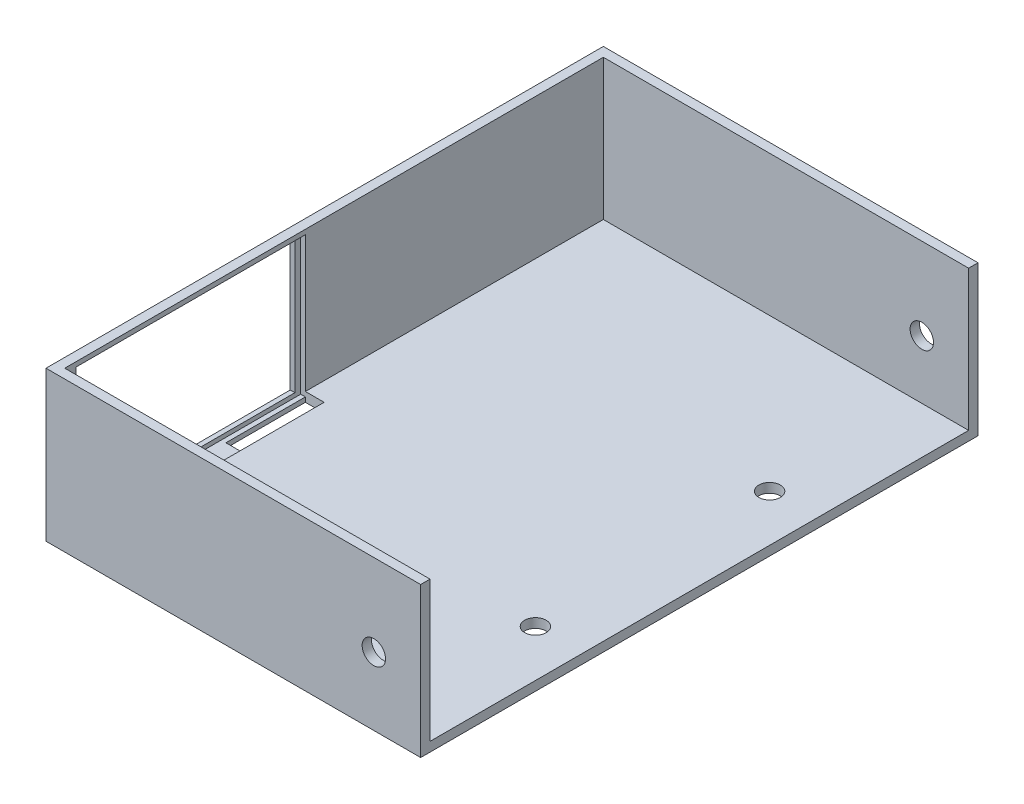
ISO-10303-21;
HEADER;
FILE_DESCRIPTION(('STEP AP214'),'2;1');
FILE_NAME('part.step','',(''),(''),'','','');
FILE_SCHEMA(('AUTOMOTIVE_DESIGN { 1 0 10303 214 1 1 1 1 }'));
ENDSEC;
DATA;
#1=APPLICATION_CONTEXT('core data for automotive mechanical design processes');
#2=APPLICATION_PROTOCOL_DEFINITION('international standard','automotive_design',2000,#1);
#3=PRODUCT_CONTEXT('',#1,'mechanical');
#4=PRODUCT('Part','Part','',(#3));
#5=PRODUCT_RELATED_PRODUCT_CATEGORY('part','',(#4));
#6=PRODUCT_DEFINITION_FORMATION('','',#4);
#7=PRODUCT_DEFINITION_CONTEXT('part definition',#1,'design');
#8=PRODUCT_DEFINITION('design','',#6,#7);
#9=PRODUCT_DEFINITION_SHAPE('','',#8);
#10=(LENGTH_UNIT() NAMED_UNIT(*) SI_UNIT(.MILLI.,.METRE.));
#11=(NAMED_UNIT(*) PLANE_ANGLE_UNIT() SI_UNIT($,.RADIAN.));
#12=(NAMED_UNIT(*) SI_UNIT($,.STERADIAN.) SOLID_ANGLE_UNIT());
#13=UNCERTAINTY_MEASURE_WITH_UNIT(LENGTH_MEASURE(1.E-05),#10,'distance_accuracy_value','');
#14=(GEOMETRIC_REPRESENTATION_CONTEXT(3) GLOBAL_UNCERTAINTY_ASSIGNED_CONTEXT((#13)) GLOBAL_UNIT_ASSIGNED_CONTEXT((#10,
#11,#12)) REPRESENTATION_CONTEXT('',''));
#15=CARTESIAN_POINT('',(0.,0.,0.));
#16=DIRECTION('',(0.,0.,1.));
#17=DIRECTION('',(1.,0.,0.));
#18=AXIS2_PLACEMENT_3D('',#15,#16,#17);
#19=CARTESIAN_POINT('',(0.,2.,0.));
#20=DIRECTION('',(0.,-1.,0.));
#21=DIRECTION('',(0.,0.,-1.));
#22=AXIS2_PLACEMENT_3D('',#19,#20,#21);
#23=PLANE('',#22);
#24=CARTESIAN_POINT('',(30.,2.,25.));
#25=DIRECTION('',(0.,-1.,0.));
#26=DIRECTION('',(0.,0.,-1.));
#27=AXIS2_PLACEMENT_3D('',#24,#25,#26);
#28=CIRCLE('',#27,2.3);
#29=CARTESIAN_POINT('',(30.,2.,22.7));
#30=VERTEX_POINT('',#29);
#31=EDGE_CURVE('E512',#30,#30,#28,.T.);
#32=ORIENTED_EDGE('',*,*,#31,.T.);
#33=EDGE_LOOP('',(#32));
#34=FACE_BOUND('',#33,.T.);
#35=CARTESIAN_POINT('',(30.,2.,-25.));
#36=DIRECTION('',(0.,-1.,0.));
#37=DIRECTION('',(0.,0.,-1.));
#38=AXIS2_PLACEMENT_3D('',#35,#36,#37);
#39=CIRCLE('',#38,2.3);
#40=CARTESIAN_POINT('',(30.,2.,-27.3));
#41=VERTEX_POINT('',#40);
#42=EDGE_CURVE('E514',#41,#41,#39,.T.);
#43=ORIENTED_EDGE('',*,*,#42,.T.);
#44=EDGE_LOOP('',(#43));
#45=FACE_BOUND('',#44,.T.);
#46=DIRECTION('',(-1.,0.,0.));
#47=VECTOR('',#46,1.);
#48=CARTESIAN_POINT('',(0.,2.,6.11597602506497));
#49=LINE('',#48,#47);
#50=CARTESIAN_POINT('',(-34.,2.,6.11597602506497));
#51=VERTEX_POINT('',#50);
#52=CARTESIAN_POINT('',(-38.,2.,6.11597602506497));
#53=VERTEX_POINT('',#52);
#54=EDGE_CURVE('E250',#51,#53,#49,.T.);
#55=ORIENTED_EDGE('',*,*,#54,.F.);
#56=DIRECTION('',(0.,0.,-1.));
#57=VECTOR('',#56,1.);
#58=CARTESIAN_POINT('',(-34.,2.,0.));
#59=LINE('',#58,#57);
#60=CARTESIAN_POINT('',(-34.,2.,55.0556618576681));
#61=VERTEX_POINT('',#60);
#62=EDGE_CURVE('E359',#61,#51,#59,.T.);
#63=ORIENTED_EDGE('',*,*,#62,.F.);
#64=DIRECTION('',(1.,0.,0.));
#65=VECTOR('',#64,1.);
#66=CARTESIAN_POINT('',(0.,2.,55.0556618576681));
#67=LINE('',#66,#65);
#68=CARTESIAN_POINT('',(-38.,2.,55.0556618576681));
#69=VERTEX_POINT('',#68);
#70=EDGE_CURVE('E248',#69,#61,#67,.T.);
#71=ORIENTED_EDGE('',*,*,#70,.F.);
#72=DIRECTION('',(0.,0.,1.));
#73=VECTOR('',#72,1.);
#74=CARTESIAN_POINT('',(-38.,2.,-57.5));
#75=LINE('',#74,#73);
#76=CARTESIAN_POINT('',(-38.,2.,57.5));
#77=VERTEX_POINT('',#76);
#78=EDGE_CURVE('E309',#69,#77,#75,.T.);
#79=ORIENTED_EDGE('',*,*,#78,.T.);
#80=DIRECTION('',(1.,0.,0.));
#81=VECTOR('',#80,1.);
#82=CARTESIAN_POINT('',(40.,2.,57.5));
#83=LINE('',#82,#81);
#84=CARTESIAN_POINT('',(40.,2.,57.5));
#85=VERTEX_POINT('',#84);
#86=EDGE_CURVE('E302',#77,#85,#83,.T.);
#87=ORIENTED_EDGE('',*,*,#86,.T.);
#88=DIRECTION('',(0.,0.,-1.));
#89=VECTOR('',#88,1.);
#90=CARTESIAN_POINT('',(40.,2.,-57.5));
#91=LINE('',#90,#89);
#92=CARTESIAN_POINT('',(40.,2.,-57.5));
#93=VERTEX_POINT('',#92);
#94=EDGE_CURVE('E297',#85,#93,#91,.T.);
#95=ORIENTED_EDGE('',*,*,#94,.T.);
#96=DIRECTION('',(-1.,0.,0.));
#97=VECTOR('',#96,1.);
#98=CARTESIAN_POINT('',(40.,2.,-57.5));
#99=LINE('',#98,#97);
#100=CARTESIAN_POINT('',(-38.,2.,-57.5));
#101=VERTEX_POINT('',#100);
#102=EDGE_CURVE('E289',#93,#101,#99,.T.);
#103=ORIENTED_EDGE('',*,*,#102,.T.);
#104=EDGE_CURVE('E306',#101,#53,#75,.T.);
#105=ORIENTED_EDGE('',*,*,#104,.T.);
#106=EDGE_LOOP('',(#55,#63,#71,#79,#87,#95,#103,#105));
#107=FACE_BOUND('',#106,.T.);
#108=ADVANCED_FACE('F37',(#34,#45,#107),#23,.F.);
#109=CARTESIAN_POINT('',(-38.,-138.956827827926,-57.5));
#110=DIRECTION('',(-1.,0.,0.));
#111=DIRECTION('',(0.,0.,1.));
#112=AXIS2_PLACEMENT_3D('',#109,#110,#111);
#113=PLANE('',#112);
#114=DIRECTION('',(0.,1.,0.));
#115=VECTOR('',#114,1.);
#116=CARTESIAN_POINT('',(-38.,-138.956827827926,6.11597602506497));
#117=LINE('',#116,#115);
#118=CARTESIAN_POINT('',(-38.,31.,6.11597602506497));
#119=VERTEX_POINT('',#118);
#120=EDGE_CURVE('E357',#53,#119,#117,.T.);
#121=ORIENTED_EDGE('',*,*,#120,.F.);
#122=ORIENTED_EDGE('',*,*,#104,.F.);
#123=DIRECTION('',(0.,1.,0.));
#124=VECTOR('',#123,1.);
#125=CARTESIAN_POINT('',(-38.,-138.956827827926,-57.5));
#126=LINE('',#125,#124);
#127=CARTESIAN_POINT('',(-38.,32.,-57.5));
#128=VERTEX_POINT('',#127);
#129=EDGE_CURVE('E296',#101,#128,#126,.T.);
#130=ORIENTED_EDGE('',*,*,#129,.T.);
#131=DIRECTION('',(0.,0.,1.));
#132=VECTOR('',#131,1.);
#133=CARTESIAN_POINT('',(-38.,32.,-57.5));
#134=LINE('',#133,#132);
#135=CARTESIAN_POINT('',(-38.,32.,57.5));
#136=VERTEX_POINT('',#135);
#137=EDGE_CURVE('E290',#128,#136,#134,.T.);
#138=ORIENTED_EDGE('',*,*,#137,.T.);
#139=DIRECTION('',(0.,1.,0.));
#140=VECTOR('',#139,1.);
#141=CARTESIAN_POINT('',(-38.,-138.956827827926,57.5));
#142=LINE('',#141,#140);
#143=EDGE_CURVE('E305',#77,#136,#142,.T.);
#144=ORIENTED_EDGE('',*,*,#143,.F.);
#145=ORIENTED_EDGE('',*,*,#78,.F.);
#146=DIRECTION('',(0.,-1.,0.));
#147=VECTOR('',#146,1.);
#148=CARTESIAN_POINT('',(-38.,30.1,55.0556618576681));
#149=LINE('',#148,#147);
#150=CARTESIAN_POINT('',(-38.,31.,55.0556618576681));
#151=VERTEX_POINT('',#150);
#152=EDGE_CURVE('E252',#151,#69,#149,.T.);
#153=ORIENTED_EDGE('',*,*,#152,.F.);
#154=DIRECTION('',(0.,0.,1.));
#155=VECTOR('',#154,1.);
#156=CARTESIAN_POINT('',(-38.,31.,-57.5));
#157=LINE('',#156,#155);
#158=EDGE_CURVE('E354',#119,#151,#157,.T.);
#159=ORIENTED_EDGE('',*,*,#158,.F.);
#160=EDGE_LOOP('',(#121,#122,#130,#138,#144,#145,#153,#159));
#161=FACE_BOUND('',#160,.T.);
#162=ADVANCED_FACE('F390',(#161),#113,.F.);
#163=CARTESIAN_POINT('',(-48.,1.9,55.0556618576681));
#164=DIRECTION('',(0.,-1.,0.));
#165=DIRECTION('',(0.,0.,-1.));
#166=AXIS2_PLACEMENT_3D('',#163,#164,#165);
#167=PLANE('',#166);
#168=DIRECTION('',(0.,0.,1.));
#169=VECTOR('',#168,1.);
#170=CARTESIAN_POINT('',(-39.,1.9,55.0556618576681));
#171=LINE('',#170,#169);
#172=CARTESIAN_POINT('',(-39.,1.9,7.35566185766814));
#173=VERTEX_POINT('',#172);
#174=CARTESIAN_POINT('',(-39.,1.9,55.0556618576681));
#175=VERTEX_POINT('',#174);
#176=EDGE_CURVE('E246',#173,#175,#171,.T.);
#177=ORIENTED_EDGE('',*,*,#176,.F.);
#178=DIRECTION('',(1.,0.,0.));
#179=VECTOR('',#178,1.);
#180=CARTESIAN_POINT('',(-48.,1.9,7.35566185766814));
#181=LINE('',#180,#179);
#182=CARTESIAN_POINT('',(-40.,1.9,7.35566185766814));
#183=VERTEX_POINT('',#182);
#184=EDGE_CURVE('E263',#183,#173,#181,.T.);
#185=ORIENTED_EDGE('',*,*,#184,.F.);
#186=DIRECTION('',(0.,0.,-1.));
#187=VECTOR('',#186,1.);
#188=CARTESIAN_POINT('',(-40.,1.9,59.5));
#189=LINE('',#188,#187);
#190=CARTESIAN_POINT('',(-40.,1.9,55.0556618576681));
#191=VERTEX_POINT('',#190);
#192=EDGE_CURVE('E347',#191,#183,#189,.T.);
#193=ORIENTED_EDGE('',*,*,#192,.F.);
#194=DIRECTION('',(1.,0.,0.));
#195=VECTOR('',#194,1.);
#196=CARTESIAN_POINT('',(-48.,1.9,55.0556618576681));
#197=LINE('',#196,#195);
#198=EDGE_CURVE('E255',#191,#175,#197,.T.);
#199=ORIENTED_EDGE('',*,*,#198,.T.);
#200=EDGE_LOOP('',(#177,#185,#193,#199));
#201=FACE_BOUND('',#200,.T.);
#202=ADVANCED_FACE('F445',(#201),#167,.F.);
#203=CARTESIAN_POINT('',(-48.,30.1,55.0556618576681));
#204=DIRECTION('',(0.,1.,0.));
#205=DIRECTION('',(0.,0.,1.));
#206=AXIS2_PLACEMENT_3D('',#203,#204,#205);
#207=PLANE('',#206);
#208=DIRECTION('',(0.,0.,-1.));
#209=VECTOR('',#208,1.);
#210=CARTESIAN_POINT('',(-39.,30.1,55.0556618576681));
#211=LINE('',#210,#209);
#212=CARTESIAN_POINT('',(-39.,30.1,55.0556618576681));
#213=VERTEX_POINT('',#212);
#214=CARTESIAN_POINT('',(-39.,30.1,7.35566185766814));
#215=VERTEX_POINT('',#214);
#216=EDGE_CURVE('E235',#213,#215,#211,.T.);
#217=ORIENTED_EDGE('',*,*,#216,.F.);
#218=DIRECTION('',(1.,0.,0.));
#219=VECTOR('',#218,1.);
#220=CARTESIAN_POINT('',(-48.,30.1,55.0556618576681));
#221=LINE('',#220,#219);
#222=CARTESIAN_POINT('',(-40.,30.1,55.0556618576681));
#223=VERTEX_POINT('',#222);
#224=EDGE_CURVE('E256',#223,#213,#221,.T.);
#225=ORIENTED_EDGE('',*,*,#224,.F.);
#226=DIRECTION('',(0.,0.,1.));
#227=VECTOR('',#226,1.);
#228=CARTESIAN_POINT('',(-40.,30.1,59.5));
#229=LINE('',#228,#227);
#230=CARTESIAN_POINT('',(-40.,30.1,7.35566185766814));
#231=VERTEX_POINT('',#230);
#232=EDGE_CURVE('E270',#231,#223,#229,.T.);
#233=ORIENTED_EDGE('',*,*,#232,.F.);
#234=DIRECTION('',(1.,0.,0.));
#235=VECTOR('',#234,1.);
#236=CARTESIAN_POINT('',(-48.,30.1,7.35566185766814));
#237=LINE('',#236,#235);
#238=EDGE_CURVE('E260',#231,#215,#237,.T.);
#239=ORIENTED_EDGE('',*,*,#238,.T.);
#240=EDGE_LOOP('',(#217,#225,#233,#239));
#241=FACE_BOUND('',#240,.T.);
#242=ADVANCED_FACE('F465',(#241),#207,.F.);
#243=CARTESIAN_POINT('',(-48.,30.1,7.35566185766814));
#244=DIRECTION('',(0.,0.,-1.));
#245=DIRECTION('',(-1.,0.,0.));
#246=AXIS2_PLACEMENT_3D('',#243,#244,#245);
#247=PLANE('',#246);
#248=DIRECTION('',(0.,-1.,0.));
#249=VECTOR('',#248,1.);
#250=CARTESIAN_POINT('',(-39.,30.1,7.35566185766814));
#251=LINE('',#250,#249);
#252=EDGE_CURVE('E352',#215,#173,#251,.T.);
#253=ORIENTED_EDGE('',*,*,#252,.F.);
#254=ORIENTED_EDGE('',*,*,#238,.F.);
#255=DIRECTION('',(0.,1.,0.));
#256=VECTOR('',#255,1.);
#257=CARTESIAN_POINT('',(-40.,32.,7.35566185766814));
#258=LINE('',#257,#256);
#259=EDGE_CURVE('E259',#183,#231,#258,.T.);
#260=ORIENTED_EDGE('',*,*,#259,.F.);
#261=ORIENTED_EDGE('',*,*,#184,.T.);
#262=EDGE_LOOP('',(#253,#254,#260,#261));
#263=FACE_BOUND('',#262,.T.);
#264=ADVANCED_FACE('F467',(#263),#247,.F.);
#265=CARTESIAN_POINT('',(40.,32.,59.5));
#266=DIRECTION('',(-1.,0.,0.));
#267=DIRECTION('',(0.,0.,1.));
#268=AXIS2_PLACEMENT_3D('',#265,#266,#267);
#269=PLANE('',#268);
#270=DIRECTION('',(0.,0.,-1.));
#271=VECTOR('',#270,1.);
#272=CARTESIAN_POINT('',(40.,32.,59.5));
#273=LINE('',#272,#271);
#274=CARTESIAN_POINT('',(40.,32.,-57.5));
#275=VERTEX_POINT('',#274);
#276=CARTESIAN_POINT('',(40.,32.,-59.5));
#277=VERTEX_POINT('',#276);
#278=EDGE_CURVE('E321',#275,#277,#273,.T.);
#279=ORIENTED_EDGE('',*,*,#278,.F.);
#280=DIRECTION('',(0.,1.,0.));
#281=VECTOR('',#280,1.);
#282=CARTESIAN_POINT('',(40.,-138.956827827926,-57.5));
#283=LINE('',#282,#281);
#284=EDGE_CURVE('E300',#93,#275,#283,.T.);
#285=ORIENTED_EDGE('',*,*,#284,.F.);
#286=ORIENTED_EDGE('',*,*,#94,.F.);
#287=DIRECTION('',(0.,1.,0.));
#288=VECTOR('',#287,1.);
#289=CARTESIAN_POINT('',(40.,-138.956827827926,57.5));
#290=LINE('',#289,#288);
#291=CARTESIAN_POINT('',(40.,32.,57.5));
#292=VERTEX_POINT('',#291);
#293=EDGE_CURVE('E301',#85,#292,#290,.T.);
#294=ORIENTED_EDGE('',*,*,#293,.T.);
#295=CARTESIAN_POINT('',(40.,32.,59.5));
#296=VERTEX_POINT('',#295);
#297=EDGE_CURVE('E317',#296,#292,#273,.T.);
#298=ORIENTED_EDGE('',*,*,#297,.F.);
#299=DIRECTION('',(0.,-1.,0.));
#300=VECTOR('',#299,1.);
#301=CARTESIAN_POINT('',(40.,32.,59.5));
#302=LINE('',#301,#300);
#303=CARTESIAN_POINT('',(40.,0.,59.5));
#304=VERTEX_POINT('',#303);
#305=EDGE_CURVE('E327',#296,#304,#302,.T.);
#306=ORIENTED_EDGE('',*,*,#305,.T.);
#307=DIRECTION('',(0.,0.,-1.));
#308=VECTOR('',#307,1.);
#309=CARTESIAN_POINT('',(40.,0.,59.5));
#310=LINE('',#309,#308);
#311=CARTESIAN_POINT('',(40.,0.,-59.5));
#312=VERTEX_POINT('',#311);
#313=EDGE_CURVE('E316',#304,#312,#310,.T.);
#314=ORIENTED_EDGE('',*,*,#313,.T.);
#315=DIRECTION('',(0.,-1.,0.));
#316=VECTOR('',#315,1.);
#317=CARTESIAN_POINT('',(40.,32.,-59.5));
#318=LINE('',#317,#316);
#319=EDGE_CURVE('E344',#277,#312,#318,.T.);
#320=ORIENTED_EDGE('',*,*,#319,.F.);
#321=EDGE_LOOP('',(#279,#285,#286,#294,#298,#306,#314,#320));
#322=FACE_BOUND('',#321,.T.);
#323=ADVANCED_FACE('F39',(#322),#269,.F.);
#324=CARTESIAN_POINT('',(-40.,32.,-59.5));
#325=DIRECTION('',(0.,0.,1.));
#326=DIRECTION('',(1.,0.,0.));
#327=AXIS2_PLACEMENT_3D('',#324,#325,#326);
#328=PLANE('',#327);
#329=CARTESIAN_POINT('',(30.,14.5,-59.5));
#330=DIRECTION('',(0.,0.,1.));
#331=DIRECTION('',(1.,0.,0.));
#332=AXIS2_PLACEMENT_3D('',#329,#330,#331);
#333=CIRCLE('',#332,2.5);
#334=CARTESIAN_POINT('',(32.5,14.5,-59.5));
#335=VERTEX_POINT('',#334);
#336=EDGE_CURVE('E276',#335,#335,#333,.T.);
#337=ORIENTED_EDGE('',*,*,#336,.T.);
#338=EDGE_LOOP('',(#337));
#339=FACE_BOUND('',#338,.T.);
#340=DIRECTION('',(-1.,0.,0.));
#341=VECTOR('',#340,1.);
#342=CARTESIAN_POINT('',(-40.,0.,-59.5));
#343=LINE('',#342,#341);
#344=CARTESIAN_POINT('',(-40.,0.,-59.5));
#345=VERTEX_POINT('',#344);
#346=EDGE_CURVE('E330',#312,#345,#343,.T.);
#347=ORIENTED_EDGE('',*,*,#346,.T.);
#348=DIRECTION('',(0.,-1.,0.));
#349=VECTOR('',#348,1.);
#350=CARTESIAN_POINT('',(-40.,32.,-59.5));
#351=LINE('',#350,#349);
#352=CARTESIAN_POINT('',(-40.,32.,-59.5));
#353=VERTEX_POINT('',#352);
#354=EDGE_CURVE('E341',#353,#345,#351,.T.);
#355=ORIENTED_EDGE('',*,*,#354,.F.);
#356=DIRECTION('',(-1.,0.,0.));
#357=VECTOR('',#356,1.);
#358=CARTESIAN_POINT('',(-40.,32.,-59.5));
#359=LINE('',#358,#357);
#360=EDGE_CURVE('E320',#277,#353,#359,.T.);
#361=ORIENTED_EDGE('',*,*,#360,.F.);
#362=ORIENTED_EDGE('',*,*,#319,.T.);
#363=EDGE_LOOP('',(#347,#355,#361,#362));
#364=FACE_BOUND('',#363,.T.);
#365=ADVANCED_FACE('F413',(#339,#364),#328,.F.);
#366=CARTESIAN_POINT('',(-40.,32.,59.5));
#367=DIRECTION('',(1.,0.,0.));
#368=DIRECTION('',(0.,0.,-1.));
#369=AXIS2_PLACEMENT_3D('',#366,#367,#368);
#370=PLANE('',#369);
#371=ORIENTED_EDGE('',*,*,#232,.T.);
#372=DIRECTION('',(0.,-1.,0.));
#373=VECTOR('',#372,1.);
#374=CARTESIAN_POINT('',(-40.,32.,55.0556618576681));
#375=LINE('',#374,#373);
#376=EDGE_CURVE('E273',#223,#191,#375,.T.);
#377=ORIENTED_EDGE('',*,*,#376,.T.);
#378=ORIENTED_EDGE('',*,*,#192,.T.);
#379=ORIENTED_EDGE('',*,*,#259,.T.);
#380=EDGE_LOOP('',(#371,#377,#378,#379));
#381=FACE_BOUND('',#380,.T.);
#382=DIRECTION('',(0.,0.,1.));
#383=VECTOR('',#382,1.);
#384=CARTESIAN_POINT('',(-40.,0.,59.5));
#385=LINE('',#384,#383);
#386=CARTESIAN_POINT('',(-40.,0.,59.5));
#387=VERTEX_POINT('',#386);
#388=EDGE_CURVE('E332',#345,#387,#385,.T.);
#389=ORIENTED_EDGE('',*,*,#388,.T.);
#390=DIRECTION('',(0.,-1.,0.));
#391=VECTOR('',#390,1.);
#392=CARTESIAN_POINT('',(-40.,32.,59.5));
#393=LINE('',#392,#391);
#394=CARTESIAN_POINT('',(-40.,32.,59.5));
#395=VERTEX_POINT('',#394);
#396=EDGE_CURVE('E338',#395,#387,#393,.T.);
#397=ORIENTED_EDGE('',*,*,#396,.F.);
#398=DIRECTION('',(0.,0.,1.));
#399=VECTOR('',#398,1.);
#400=CARTESIAN_POINT('',(-40.,32.,59.5));
#401=LINE('',#400,#399);
#402=EDGE_CURVE('E323',#353,#395,#401,.T.);
#403=ORIENTED_EDGE('',*,*,#402,.F.);
#404=ORIENTED_EDGE('',*,*,#354,.T.);
#405=EDGE_LOOP('',(#389,#397,#403,#404));
#406=FACE_BOUND('',#405,.T.);
#407=ADVANCED_FACE('F418',(#381,#406),#370,.F.);
#408=CARTESIAN_POINT('',(-40.,32.,59.5));
#409=DIRECTION('',(0.,0.,-1.));
#410=DIRECTION('',(-1.,0.,0.));
#411=AXIS2_PLACEMENT_3D('',#408,#409,#410);
#412=PLANE('',#411);
#413=CARTESIAN_POINT('',(30.,14.5,59.5));
#414=DIRECTION('',(0.,0.,-1.));
#415=DIRECTION('',(-1.,0.,0.));
#416=AXIS2_PLACEMENT_3D('',#413,#414,#415);
#417=CIRCLE('',#416,2.5);
#418=CARTESIAN_POINT('',(32.5,14.5,59.5));
#419=VERTEX_POINT('',#418);
#420=EDGE_CURVE('E283',#419,#419,#417,.T.);
#421=ORIENTED_EDGE('',*,*,#420,.T.);
#422=EDGE_LOOP('',(#421));
#423=FACE_BOUND('',#422,.T.);
#424=DIRECTION('',(1.,0.,0.));
#425=VECTOR('',#424,1.);
#426=CARTESIAN_POINT('',(-40.,0.,59.5));
#427=LINE('',#426,#425);
#428=EDGE_CURVE('E334',#387,#304,#427,.T.);
#429=ORIENTED_EDGE('',*,*,#428,.T.);
#430=ORIENTED_EDGE('',*,*,#305,.F.);
#431=DIRECTION('',(1.,0.,0.));
#432=VECTOR('',#431,1.);
#433=CARTESIAN_POINT('',(-40.,32.,59.5));
#434=LINE('',#433,#432);
#435=EDGE_CURVE('E325',#395,#296,#434,.T.);
#436=ORIENTED_EDGE('',*,*,#435,.F.);
#437=ORIENTED_EDGE('',*,*,#396,.T.);
#438=EDGE_LOOP('',(#429,#430,#436,#437));
#439=FACE_BOUND('',#438,.T.);
#440=ADVANCED_FACE('F422',(#423,#439),#412,.F.);
#441=CARTESIAN_POINT('',(0.,32.,0.));
#442=DIRECTION('',(0.,-1.,0.));
#443=DIRECTION('',(0.,0.,-1.));
#444=AXIS2_PLACEMENT_3D('',#441,#442,#443);
#445=PLANE('',#444);
#446=ORIENTED_EDGE('',*,*,#137,.F.);
#447=DIRECTION('',(-1.,0.,0.));
#448=VECTOR('',#447,1.);
#449=CARTESIAN_POINT('',(40.,32.,-57.5));
#450=LINE('',#449,#448);
#451=EDGE_CURVE('E286',#275,#128,#450,.T.);
#452=ORIENTED_EDGE('',*,*,#451,.F.);
#453=ORIENTED_EDGE('',*,*,#278,.T.);
#454=ORIENTED_EDGE('',*,*,#360,.T.);
#455=ORIENTED_EDGE('',*,*,#402,.T.);
#456=ORIENTED_EDGE('',*,*,#435,.T.);
#457=ORIENTED_EDGE('',*,*,#297,.T.);
#458=DIRECTION('',(1.,0.,0.));
#459=VECTOR('',#458,1.);
#460=CARTESIAN_POINT('',(40.,32.,57.5));
#461=LINE('',#460,#459);
#462=EDGE_CURVE('E287',#136,#292,#461,.T.);
#463=ORIENTED_EDGE('',*,*,#462,.F.);
#464=EDGE_LOOP('',(#446,#452,#453,#454,#455,#456,#457,#463));
#465=FACE_BOUND('',#464,.T.);
#466=ADVANCED_FACE('F400',(#465),#445,.F.);
#467=CARTESIAN_POINT('',(0.,0.,0.));
#468=DIRECTION('',(0.,-1.,0.));
#469=DIRECTION('',(0.,0.,-1.));
#470=AXIS2_PLACEMENT_3D('',#467,#468,#469);
#471=PLANE('',#470);
#472=CARTESIAN_POINT('',(30.,0.,25.));
#473=DIRECTION('',(0.,-1.,0.));
#474=DIRECTION('',(0.,0.,-1.));
#475=AXIS2_PLACEMENT_3D('',#472,#473,#474);
#476=CIRCLE('',#475,2.3);
#477=CARTESIAN_POINT('',(30.,0.,22.7));
#478=VERTEX_POINT('',#477);
#479=EDGE_CURVE('E510',#478,#478,#476,.T.);
#480=ORIENTED_EDGE('',*,*,#479,.F.);
#481=EDGE_LOOP('',(#480));
#482=FACE_BOUND('',#481,.T.);
#483=CARTESIAN_POINT('',(30.,0.,-25.));
#484=DIRECTION('',(0.,-1.,0.));
#485=DIRECTION('',(0.,0.,-1.));
#486=AXIS2_PLACEMENT_3D('',#483,#484,#485);
#487=CIRCLE('',#486,2.3);
#488=CARTESIAN_POINT('',(30.,0.,-27.3));
#489=VERTEX_POINT('',#488);
#490=EDGE_CURVE('E739',#489,#489,#487,.T.);
#491=ORIENTED_EDGE('',*,*,#490,.F.);
#492=EDGE_LOOP('',(#491));
#493=FACE_BOUND('',#492,.T.);
#494=DIRECTION('',(0.,0.,1.));
#495=VECTOR('',#494,1.);
#496=CARTESIAN_POINT('',(-34.,0.,0.));
#497=LINE('',#496,#495);
#498=CARTESIAN_POINT('',(-34.,0.,6.11597602506497));
#499=VERTEX_POINT('',#498);
#500=CARTESIAN_POINT('',(-34.,0.,23.0858189413666));
#501=VERTEX_POINT('',#500);
#502=EDGE_CURVE('E13',#499,#501,#497,.T.);
#503=ORIENTED_EDGE('',*,*,#502,.F.);
#504=DIRECTION('',(1.,0.,0.));
#505=VECTOR('',#504,1.);
#506=CARTESIAN_POINT('',(0.,0.,6.11597602506497));
#507=LINE('',#506,#505);
#508=CARTESIAN_POINT('',(-38.,0.,6.11597602506497));
#509=VERTEX_POINT('',#508);
#510=EDGE_CURVE('E370',#509,#499,#507,.T.);
#511=ORIENTED_EDGE('',*,*,#510,.F.);
#512=DIRECTION('',(0.,0.,-1.));
#513=VECTOR('',#512,1.);
#514=CARTESIAN_POINT('',(-38.,0.,0.));
#515=LINE('',#514,#513);
#516=CARTESIAN_POINT('',(-38.,0.,23.0858189413666));
#517=VERTEX_POINT('',#516);
#518=EDGE_CURVE('E200',#517,#509,#515,.T.);
#519=ORIENTED_EDGE('',*,*,#518,.F.);
#520=DIRECTION('',(-1.,0.,0.));
#521=VECTOR('',#520,1.);
#522=CARTESIAN_POINT('',(0.,0.,23.0858189413666));
#523=LINE('',#522,#521);
#524=EDGE_CURVE('E45',#501,#517,#523,.T.);
#525=ORIENTED_EDGE('',*,*,#524,.F.);
#526=EDGE_LOOP('',(#503,#511,#519,#525));
#527=FACE_BOUND('',#526,.T.);
#528=DIRECTION('',(0.,0.,-1.));
#529=VECTOR('',#528,1.);
#530=CARTESIAN_POINT('',(-38.,0.,0.));
#531=LINE('',#530,#529);
#532=CARTESIAN_POINT('',(-38.,0.,55.0556618576681));
#533=VERTEX_POINT('',#532);
#534=CARTESIAN_POINT('',(-38.,0.,38.0858189413666));
#535=VERTEX_POINT('',#534);
#536=EDGE_CURVE('E368',#533,#535,#531,.T.);
#537=ORIENTED_EDGE('',*,*,#536,.F.);
#538=DIRECTION('',(-1.,0.,0.));
#539=VECTOR('',#538,1.);
#540=CARTESIAN_POINT('',(0.,0.,55.0556618576681));
#541=LINE('',#540,#539);
#542=CARTESIAN_POINT('',(-34.,0.,55.0556618576681));
#543=VERTEX_POINT('',#542);
#544=EDGE_CURVE('E361',#543,#533,#541,.T.);
#545=ORIENTED_EDGE('',*,*,#544,.F.);
#546=DIRECTION('',(0.,0.,1.));
#547=VECTOR('',#546,1.);
#548=CARTESIAN_POINT('',(-34.,0.,0.));
#549=LINE('',#548,#547);
#550=CARTESIAN_POINT('',(-34.,0.,38.0858189413666));
#551=VERTEX_POINT('',#550);
#552=EDGE_CURVE('E363',#551,#543,#549,.T.);
#553=ORIENTED_EDGE('',*,*,#552,.F.);
#554=DIRECTION('',(1.,0.,0.));
#555=VECTOR('',#554,1.);
#556=CARTESIAN_POINT('',(0.,0.,38.0858189413666));
#557=LINE('',#556,#555);
#558=EDGE_CURVE('E366',#535,#551,#557,.T.);
#559=ORIENTED_EDGE('',*,*,#558,.F.);
#560=EDGE_LOOP('',(#537,#545,#553,#559));
#561=FACE_BOUND('',#560,.T.);
#562=ORIENTED_EDGE('',*,*,#313,.F.);
#563=ORIENTED_EDGE('',*,*,#428,.F.);
#564=ORIENTED_EDGE('',*,*,#388,.F.);
#565=ORIENTED_EDGE('',*,*,#346,.F.);
#566=EDGE_LOOP('',(#562,#563,#564,#565));
#567=FACE_BOUND('',#566,.T.);
#568=ADVANCED_FACE('F380',(#482,#493,#527,#561,#567),#471,.T.);
#569=CARTESIAN_POINT('',(40.,-138.956827827926,-57.5));
#570=DIRECTION('',(0.,0.,-1.));
#571=DIRECTION('',(-1.,0.,0.));
#572=AXIS2_PLACEMENT_3D('',#569,#570,#571);
#573=PLANE('',#572);
#574=CARTESIAN_POINT('',(30.,14.5,-57.5));
#575=DIRECTION('',(0.,0.,-1.));
#576=DIRECTION('',(-1.,0.,0.));
#577=AXIS2_PLACEMENT_3D('',#574,#575,#576);
#578=CIRCLE('',#577,2.5);
#579=CARTESIAN_POINT('',(32.5,14.5,-57.5));
#580=VERTEX_POINT('',#579);
#581=EDGE_CURVE('E280',#580,#580,#578,.T.);
#582=ORIENTED_EDGE('',*,*,#581,.T.);
#583=EDGE_LOOP('',(#582));
#584=FACE_BOUND('',#583,.T.);
#585=ORIENTED_EDGE('',*,*,#284,.T.);
#586=ORIENTED_EDGE('',*,*,#451,.T.);
#587=ORIENTED_EDGE('',*,*,#129,.F.);
#588=ORIENTED_EDGE('',*,*,#102,.F.);
#589=EDGE_LOOP('',(#585,#586,#587,#588));
#590=FACE_BOUND('',#589,.T.);
#591=ADVANCED_FACE('F393',(#584,#590),#573,.F.);
#592=CARTESIAN_POINT('',(40.,-138.956827827926,57.5));
#593=DIRECTION('',(0.,0.,1.));
#594=DIRECTION('',(1.,0.,0.));
#595=AXIS2_PLACEMENT_3D('',#592,#593,#594);
#596=PLANE('',#595);
#597=CARTESIAN_POINT('',(30.,14.5,57.5));
#598=DIRECTION('',(0.,0.,1.));
#599=DIRECTION('',(1.,0.,0.));
#600=AXIS2_PLACEMENT_3D('',#597,#598,#599);
#601=CIRCLE('',#600,2.5);
#602=CARTESIAN_POINT('',(32.5,14.5,57.5));
#603=VERTEX_POINT('',#602);
#604=EDGE_CURVE('E279',#603,#603,#601,.T.);
#605=ORIENTED_EDGE('',*,*,#604,.T.);
#606=EDGE_LOOP('',(#605));
#607=FACE_BOUND('',#606,.T.);
#608=ORIENTED_EDGE('',*,*,#143,.T.);
#609=ORIENTED_EDGE('',*,*,#462,.T.);
#610=ORIENTED_EDGE('',*,*,#293,.F.);
#611=ORIENTED_EDGE('',*,*,#86,.F.);
#612=EDGE_LOOP('',(#608,#609,#610,#611));
#613=FACE_BOUND('',#612,.T.);
#614=ADVANCED_FACE('F405',(#607,#613),#596,.F.);
#615=CARTESIAN_POINT('',(30.,14.5,-59.5));
#616=DIRECTION('',(0.,0.,1.));
#617=DIRECTION('',(1.,0.,0.));
#618=AXIS2_PLACEMENT_3D('',#615,#616,#617);
#619=CYLINDRICAL_SURFACE('',#618,2.5);
#620=CARTESIAN_POINT('',(32.5,14.5,57.5));
#621=CARTESIAN_POINT('',(32.5,14.5,57.5208333333333));
#622=CARTESIAN_POINT('',(32.5,14.5,57.5416666666667));
#623=CARTESIAN_POINT('',(32.5,14.5,57.5833333333333));
#624=CARTESIAN_POINT('',(32.5,14.5,57.6041666666667));
#625=CARTESIAN_POINT('',(32.5,14.5,57.6458333333333));
#626=CARTESIAN_POINT('',(32.5,14.5,57.6666666666667));
#627=CARTESIAN_POINT('',(32.5,14.5,57.7083333333333));
#628=CARTESIAN_POINT('',(32.5,14.5,57.7291666666667));
#629=CARTESIAN_POINT('',(32.5,14.5,57.7708333333333));
#630=CARTESIAN_POINT('',(32.5,14.5,57.7916666666667));
#631=CARTESIAN_POINT('',(32.5,14.5,57.8333333333333));
#632=CARTESIAN_POINT('',(32.5,14.5,57.8541666666667));
#633=CARTESIAN_POINT('',(32.5,14.5,57.8958333333333));
#634=CARTESIAN_POINT('',(32.5,14.5,57.9166666666667));
#635=CARTESIAN_POINT('',(32.5,14.5,57.9583333333333));
#636=CARTESIAN_POINT('',(32.5,14.5,57.9791666666667));
#637=CARTESIAN_POINT('',(32.5,14.5,58.0208333333333));
#638=CARTESIAN_POINT('',(32.5,14.5,58.0416666666667));
#639=CARTESIAN_POINT('',(32.5,14.5,58.0833333333333));
#640=CARTESIAN_POINT('',(32.5,14.5,58.1041666666667));
#641=CARTESIAN_POINT('',(32.5,14.5,58.1458333333333));
#642=CARTESIAN_POINT('',(32.5,14.5,58.1666666666667));
#643=CARTESIAN_POINT('',(32.5,14.5,58.2083333333333));
#644=CARTESIAN_POINT('',(32.5,14.5,58.2291666666667));
#645=CARTESIAN_POINT('',(32.5,14.5,58.2708333333333));
#646=CARTESIAN_POINT('',(32.5,14.5,58.2916666666667));
#647=CARTESIAN_POINT('',(32.5,14.5,58.3333333333333));
#648=CARTESIAN_POINT('',(32.5,14.5,58.3541666666667));
#649=CARTESIAN_POINT('',(32.5,14.5,58.3958333333333));
#650=CARTESIAN_POINT('',(32.5,14.5,58.4166666666667));
#651=CARTESIAN_POINT('',(32.5,14.5,58.4583333333333));
#652=CARTESIAN_POINT('',(32.5,14.5,58.4791666666667));
#653=CARTESIAN_POINT('',(32.5,14.5,58.5208333333333));
#654=CARTESIAN_POINT('',(32.5,14.5,58.5416666666667));
#655=CARTESIAN_POINT('',(32.5,14.5,58.5833333333333));
#656=CARTESIAN_POINT('',(32.5,14.5,58.6041666666667));
#657=CARTESIAN_POINT('',(32.5,14.5,58.6458333333333));
#658=CARTESIAN_POINT('',(32.5,14.5,58.6666666666667));
#659=CARTESIAN_POINT('',(32.5,14.5,58.7083333333333));
#660=CARTESIAN_POINT('',(32.5,14.5,58.7291666666667));
#661=CARTESIAN_POINT('',(32.5,14.5,58.7708333333333));
#662=CARTESIAN_POINT('',(32.5,14.5,58.7916666666667));
#663=CARTESIAN_POINT('',(32.5,14.5,58.8333333333333));
#664=CARTESIAN_POINT('',(32.5,14.5,58.8541666666667));
#665=CARTESIAN_POINT('',(32.5,14.5,58.8958333333333));
#666=CARTESIAN_POINT('',(32.5,14.5,58.9166666666667));
#667=CARTESIAN_POINT('',(32.5,14.5,58.9583333333333));
#668=CARTESIAN_POINT('',(32.5,14.5,58.9791666666667));
#669=CARTESIAN_POINT('',(32.5,14.5,59.0208333333333));
#670=CARTESIAN_POINT('',(32.5,14.5,59.0416666666667));
#671=CARTESIAN_POINT('',(32.5,14.5,59.0833333333333));
#672=CARTESIAN_POINT('',(32.5,14.5,59.1041666666667));
#673=CARTESIAN_POINT('',(32.5,14.5,59.1458333333333));
#674=CARTESIAN_POINT('',(32.5,14.5,59.1666666666667));
#675=CARTESIAN_POINT('',(32.5,14.5,59.2083333333333));
#676=CARTESIAN_POINT('',(32.5,14.5,59.2291666666667));
#677=CARTESIAN_POINT('',(32.5,14.5,59.2708333333333));
#678=CARTESIAN_POINT('',(32.5,14.5,59.2916666666667));
#679=CARTESIAN_POINT('',(32.5,14.5,59.3333333333333));
#680=CARTESIAN_POINT('',(32.5,14.5,59.3541666666667));
#681=CARTESIAN_POINT('',(32.5,14.5,59.3958333333333));
#682=CARTESIAN_POINT('',(32.5,14.5,59.4166666666667));
#683=CARTESIAN_POINT('',(32.5,14.5,59.4583333333333));
#684=CARTESIAN_POINT('',(32.5,14.5,59.4791666666667));
#685=CARTESIAN_POINT('',(32.5,14.5,59.5));
#686=B_SPLINE_CURVE_WITH_KNOTS('',3,(#620,#621,#622,#623,#624,#625,#626,#627,#628,#629,#630,
#631,#632,#633,#634,#635,#636,#637,#638,#639,#640,#641,#642,#643,#644,#645,#646,#647,#648,#649,
#650,#651,#652,#653,#654,#655,#656,#657,#658,#659,#660,#661,#662,#663,#664,#665,#666,#667,#668,
#669,#670,#671,#672,#673,#674,#675,#676,#677,#678,#679,#680,#681,#682,#683,#684,#685),
.UNSPECIFIED.,.F.,.F.,(4,2,2,2,2,2,2,2,2,2,2,2,2,2,2,2,2,2,2,2,2,2,2,2,2,2,2,2,2,2,2,2,4),(0.,
0.0624999999999931,0.125,0.187500000000007,0.25,0.312499999999993,0.375,0.437500000000007,0.5,
0.562499999999994,0.625000000000001,0.687500000000008,0.750000000000001,0.812499999999994,
0.875000000000001,0.937500000000008,1.,1.06249999999999,1.125,1.18750000000001,1.25,
1.31249999999999,1.375,1.43750000000001,1.5,1.56249999999999,1.625,1.68750000000001,1.75,
1.81249999999999,1.875,1.93750000000001,2.),.UNSPECIFIED.);
#687=EDGE_CURVE('BSEAM452',#603,#419,#686,.T.);
#688=ORIENTED_EDGE('',*,*,#604,.F.);
#689=ORIENTED_EDGE('',*,*,#420,.F.);
#690=ORIENTED_EDGE('',*,*,#687,.T.);
#691=ORIENTED_EDGE('',*,*,#687,.F.);
#692=EDGE_LOOP('',(#688,#690,#689,#691));
#693=FACE_BOUND('',#692,.T.);
#694=ADVANCED_FACE('F452',(#693),#619,.F.);
#695=CARTESIAN_POINT('',(32.5,14.5,-59.5));
#696=CARTESIAN_POINT('',(32.5,14.5,-59.4791666666667));
#697=CARTESIAN_POINT('',(32.5,14.5,-59.4583333333333));
#698=CARTESIAN_POINT('',(32.5,14.5,-59.4166666666667));
#699=CARTESIAN_POINT('',(32.5,14.5,-59.3958333333333));
#700=CARTESIAN_POINT('',(32.5,14.5,-59.3541666666667));
#701=CARTESIAN_POINT('',(32.5,14.5,-59.3333333333333));
#702=CARTESIAN_POINT('',(32.5,14.5,-59.2916666666667));
#703=CARTESIAN_POINT('',(32.5,14.5,-59.2708333333333));
#704=CARTESIAN_POINT('',(32.5,14.5,-59.2291666666667));
#705=CARTESIAN_POINT('',(32.5,14.5,-59.2083333333333));
#706=CARTESIAN_POINT('',(32.5,14.5,-59.1666666666667));
#707=CARTESIAN_POINT('',(32.5,14.5,-59.1458333333333));
#708=CARTESIAN_POINT('',(32.5,14.5,-59.1041666666667));
#709=CARTESIAN_POINT('',(32.5,14.5,-59.0833333333333));
#710=CARTESIAN_POINT('',(32.5,14.5,-59.0416666666667));
#711=CARTESIAN_POINT('',(32.5,14.5,-59.0208333333333));
#712=CARTESIAN_POINT('',(32.5,14.5,-58.9791666666667));
#713=CARTESIAN_POINT('',(32.5,14.5,-58.9583333333333));
#714=CARTESIAN_POINT('',(32.5,14.5,-58.9166666666667));
#715=CARTESIAN_POINT('',(32.5,14.5,-58.8958333333333));
#716=CARTESIAN_POINT('',(32.5,14.5,-58.8541666666667));
#717=CARTESIAN_POINT('',(32.5,14.5,-58.8333333333333));
#718=CARTESIAN_POINT('',(32.5,14.5,-58.7916666666667));
#719=CARTESIAN_POINT('',(32.5,14.5,-58.7708333333333));
#720=CARTESIAN_POINT('',(32.5,14.5,-58.7291666666667));
#721=CARTESIAN_POINT('',(32.5,14.5,-58.7083333333333));
#722=CARTESIAN_POINT('',(32.5,14.5,-58.6666666666667));
#723=CARTESIAN_POINT('',(32.5,14.5,-58.6458333333333));
#724=CARTESIAN_POINT('',(32.5,14.5,-58.6041666666667));
#725=CARTESIAN_POINT('',(32.5,14.5,-58.5833333333333));
#726=CARTESIAN_POINT('',(32.5,14.5,-58.5416666666667));
#727=CARTESIAN_POINT('',(32.5,14.5,-58.5208333333333));
#728=CARTESIAN_POINT('',(32.5,14.5,-58.4791666666667));
#729=CARTESIAN_POINT('',(32.5,14.5,-58.4583333333333));
#730=CARTESIAN_POINT('',(32.5,14.5,-58.4166666666667));
#731=CARTESIAN_POINT('',(32.5,14.5,-58.3958333333333));
#732=CARTESIAN_POINT('',(32.5,14.5,-58.3541666666667));
#733=CARTESIAN_POINT('',(32.5,14.5,-58.3333333333333));
#734=CARTESIAN_POINT('',(32.5,14.5,-58.2916666666667));
#735=CARTESIAN_POINT('',(32.5,14.5,-58.2708333333333));
#736=CARTESIAN_POINT('',(32.5,14.5,-58.2291666666667));
#737=CARTESIAN_POINT('',(32.5,14.5,-58.2083333333333));
#738=CARTESIAN_POINT('',(32.5,14.5,-58.1666666666667));
#739=CARTESIAN_POINT('',(32.5,14.5,-58.1458333333333));
#740=CARTESIAN_POINT('',(32.5,14.5,-58.1041666666667));
#741=CARTESIAN_POINT('',(32.5,14.5,-58.0833333333333));
#742=CARTESIAN_POINT('',(32.5,14.5,-58.0416666666667));
#743=CARTESIAN_POINT('',(32.5,14.5,-58.0208333333333));
#744=CARTESIAN_POINT('',(32.5,14.5,-57.9791666666667));
#745=CARTESIAN_POINT('',(32.5,14.5,-57.9583333333333));
#746=CARTESIAN_POINT('',(32.5,14.5,-57.9166666666667));
#747=CARTESIAN_POINT('',(32.5,14.5,-57.8958333333333));
#748=CARTESIAN_POINT('',(32.5,14.5,-57.8541666666667));
#749=CARTESIAN_POINT('',(32.5,14.5,-57.8333333333333));
#750=CARTESIAN_POINT('',(32.5,14.5,-57.7916666666667));
#751=CARTESIAN_POINT('',(32.5,14.5,-57.7708333333333));
#752=CARTESIAN_POINT('',(32.5,14.5,-57.7291666666667));
#753=CARTESIAN_POINT('',(32.5,14.5,-57.7083333333333));
#754=CARTESIAN_POINT('',(32.5,14.5,-57.6666666666667));
#755=CARTESIAN_POINT('',(32.5,14.5,-57.6458333333333));
#756=CARTESIAN_POINT('',(32.5,14.5,-57.6041666666667));
#757=CARTESIAN_POINT('',(32.5,14.5,-57.5833333333333));
#758=CARTESIAN_POINT('',(32.5,14.5,-57.5416666666667));
#759=CARTESIAN_POINT('',(32.5,14.5,-57.5208333333333));
#760=CARTESIAN_POINT('',(32.5,14.5,-57.5));
#761=B_SPLINE_CURVE_WITH_KNOTS('',3,(#695,#696,#697,#698,#699,#700,#701,#702,#703,#704,#705,
#706,#707,#708,#709,#710,#711,#712,#713,#714,#715,#716,#717,#718,#719,#720,#721,#722,#723,#724,
#725,#726,#727,#728,#729,#730,#731,#732,#733,#734,#735,#736,#737,#738,#739,#740,#741,#742,#743,
#744,#745,#746,#747,#748,#749,#750,#751,#752,#753,#754,#755,#756,#757,#758,#759,#760),
.UNSPECIFIED.,.F.,.F.,(4,2,2,2,2,2,2,2,2,2,2,2,2,2,2,2,2,2,2,2,2,2,2,2,2,2,2,2,2,2,2,2,4),(0.,
0.062500000000007,0.125000000000007,0.187500000000007,0.250000000000007,0.312500000000007,
0.375000000000007,0.437500000000007,0.500000000000007,0.562500000000007,0.625000000000008,
0.687500000000008,0.750000000000008,0.812500000000008,0.875000000000008,0.937500000000008,
1.00000000000001,1.06250000000001,1.12500000000001,1.18750000000001,1.25000000000001,
1.31250000000001,1.37500000000001,1.43750000000001,1.50000000000001,1.56250000000001,
1.62500000000001,1.68750000000001,1.75000000000001,1.81250000000001,1.87500000000001,
1.93750000000001,2.00000000000001),.UNSPECIFIED.);
#762=EDGE_CURVE('BSEAM456',#335,#580,#761,.T.);
#763=ORIENTED_EDGE('',*,*,#336,.F.);
#764=ORIENTED_EDGE('',*,*,#581,.F.);
#765=ORIENTED_EDGE('',*,*,#762,.T.);
#766=ORIENTED_EDGE('',*,*,#762,.F.);
#767=EDGE_LOOP('',(#763,#765,#764,#766));
#768=FACE_BOUND('',#767,.T.);
#769=ADVANCED_FACE('F456',(#768),#619,.F.);
#770=CARTESIAN_POINT('',(-48.,30.1,55.0556618576681));
#771=DIRECTION('',(0.,0.,1.));
#772=DIRECTION('',(1.,0.,0.));
#773=AXIS2_PLACEMENT_3D('',#770,#771,#772);
#774=PLANE('',#773);
#775=DIRECTION('',(0.,-1.,0.));
#776=VECTOR('',#775,1.);
#777=CARTESIAN_POINT('',(-39.,81.1944392121091,55.0556618576681));
#778=LINE('',#777,#776);
#779=CARTESIAN_POINT('',(-39.,1.,55.0556618576681));
#780=VERTEX_POINT('',#779);
#781=EDGE_CURVE('E240',#175,#780,#778,.T.);
#782=ORIENTED_EDGE('',*,*,#781,.F.);
#783=ORIENTED_EDGE('',*,*,#198,.F.);
#784=ORIENTED_EDGE('',*,*,#376,.F.);
#785=ORIENTED_EDGE('',*,*,#224,.T.);
#786=CARTESIAN_POINT('',(-39.,31.,55.0556618576681));
#787=VERTEX_POINT('',#786);
#788=EDGE_CURVE('E241',#787,#213,#778,.T.);
#789=ORIENTED_EDGE('',*,*,#788,.F.);
#790=DIRECTION('',(-1.,0.,0.));
#791=VECTOR('',#790,1.);
#792=CARTESIAN_POINT('',(-39.,31.,55.0556618576681));
#793=LINE('',#792,#791);
#794=EDGE_CURVE('E230',#151,#787,#793,.T.);
#795=ORIENTED_EDGE('',*,*,#794,.F.);
#796=ORIENTED_EDGE('',*,*,#152,.T.);
#797=ORIENTED_EDGE('',*,*,#70,.T.);
#798=DIRECTION('',(0.,-1.,0.));
#799=VECTOR('',#798,1.);
#800=CARTESIAN_POINT('',(-34.,81.1944392121091,55.0556618576681));
#801=LINE('',#800,#799);
#802=EDGE_CURVE('E238',#61,#543,#801,.T.);
#803=ORIENTED_EDGE('',*,*,#802,.T.);
#804=ORIENTED_EDGE('',*,*,#544,.T.);
#805=DIRECTION('',(0.,1.,0.));
#806=VECTOR('',#805,1.);
#807=CARTESIAN_POINT('',(-38.,-1.,55.0556618576681));
#808=LINE('',#807,#806);
#809=CARTESIAN_POINT('',(-38.,1.,55.0556618576681));
#810=VERTEX_POINT('',#809);
#811=EDGE_CURVE('E527',#533,#810,#808,.T.);
#812=ORIENTED_EDGE('',*,*,#811,.T.);
#813=DIRECTION('',(1.,0.,0.));
#814=VECTOR('',#813,1.);
#815=CARTESIAN_POINT('',(-39.,1.,55.0556618576681));
#816=LINE('',#815,#814);
#817=EDGE_CURVE('E226',#780,#810,#816,.T.);
#818=ORIENTED_EDGE('',*,*,#817,.F.);
#819=EDGE_LOOP('',(#782,#783,#784,#785,#789,#795,#796,#797,#803,#804,#812,#818));
#820=FACE_BOUND('',#819,.T.);
#821=ADVANCED_FACE('F458',(#820),#774,.F.);
#822=CARTESIAN_POINT('',(-34.,81.1944392121091,6.11597602506497));
#823=DIRECTION('',(-1.,0.,0.));
#824=DIRECTION('',(0.,0.,1.));
#825=AXIS2_PLACEMENT_3D('',#822,#823,#824);
#826=PLANE('',#825);
#827=ORIENTED_EDGE('',*,*,#62,.T.);
#828=DIRECTION('',(0.,-1.,0.));
#829=VECTOR('',#828,1.);
#830=CARTESIAN_POINT('',(-34.,81.1944392121091,6.11597602506497));
#831=LINE('',#830,#829);
#832=EDGE_CURVE('E224',#51,#499,#831,.T.);
#833=ORIENTED_EDGE('',*,*,#832,.T.);
#834=ORIENTED_EDGE('',*,*,#502,.T.);
#835=DIRECTION('',(0.,1.,0.));
#836=VECTOR('',#835,1.);
#837=CARTESIAN_POINT('',(-34.,-1.,23.0858189413666));
#838=LINE('',#837,#836);
#839=CARTESIAN_POINT('',(-34.,1.,23.0858189413666));
#840=VERTEX_POINT('',#839);
#841=EDGE_CURVE('E376',#501,#840,#838,.T.);
#842=ORIENTED_EDGE('',*,*,#841,.T.);
#843=DIRECTION('',(0.,0.,-1.));
#844=VECTOR('',#843,1.);
#845=CARTESIAN_POINT('',(-34.,1.,6.11597602506497));
#846=LINE('',#845,#844);
#847=CARTESIAN_POINT('',(-34.,1.,38.0858189413666));
#848=VERTEX_POINT('',#847);
#849=EDGE_CURVE('E222',#848,#840,#846,.T.);
#850=ORIENTED_EDGE('',*,*,#849,.F.);
#851=DIRECTION('',(0.,1.,0.));
#852=VECTOR('',#851,1.);
#853=CARTESIAN_POINT('',(-34.,-1.,38.0858189413666));
#854=LINE('',#853,#852);
#855=EDGE_CURVE('E60',#551,#848,#854,.T.);
#856=ORIENTED_EDGE('',*,*,#855,.F.);
#857=ORIENTED_EDGE('',*,*,#552,.T.);
#858=ORIENTED_EDGE('',*,*,#802,.F.);
#859=EDGE_LOOP('',(#827,#833,#834,#842,#850,#856,#857,#858));
#860=FACE_BOUND('',#859,.T.);
#861=ADVANCED_FACE('F461',(#860),#826,.T.);
#862=CARTESIAN_POINT('',(-39.,81.1944392121091,6.11597602506497));
#863=DIRECTION('',(0.,0.,1.));
#864=DIRECTION('',(1.,0.,0.));
#865=AXIS2_PLACEMENT_3D('',#862,#863,#864);
#866=PLANE('',#865);
#867=ORIENTED_EDGE('',*,*,#54,.T.);
#868=ORIENTED_EDGE('',*,*,#120,.T.);
#869=DIRECTION('',(1.,0.,0.));
#870=VECTOR('',#869,1.);
#871=CARTESIAN_POINT('',(-39.,31.,6.11597602506497));
#872=LINE('',#871,#870);
#873=CARTESIAN_POINT('',(-39.,31.,6.11597602506497));
#874=VERTEX_POINT('',#873);
#875=EDGE_CURVE('E233',#874,#119,#872,.T.);
#876=ORIENTED_EDGE('',*,*,#875,.F.);
#877=DIRECTION('',(0.,-1.,0.));
#878=VECTOR('',#877,1.);
#879=CARTESIAN_POINT('',(-39.,81.1944392121091,6.11597602506497));
#880=LINE('',#879,#878);
#881=CARTESIAN_POINT('',(-39.,1.,6.11597602506497));
#882=VERTEX_POINT('',#881);
#883=EDGE_CURVE('E220',#874,#882,#880,.T.);
#884=ORIENTED_EDGE('',*,*,#883,.T.);
#885=DIRECTION('',(-1.,0.,0.));
#886=VECTOR('',#885,1.);
#887=CARTESIAN_POINT('',(-39.,1.,6.11597602506497));
#888=LINE('',#887,#886);
#889=CARTESIAN_POINT('',(-38.,1.,6.11597602506497));
#890=VERTEX_POINT('',#889);
#891=EDGE_CURVE('E212',#890,#882,#888,.T.);
#892=ORIENTED_EDGE('',*,*,#891,.F.);
#893=DIRECTION('',(0.,1.,0.));
#894=VECTOR('',#893,1.);
#895=CARTESIAN_POINT('',(-38.,-1.,6.11597602506497));
#896=LINE('',#895,#894);
#897=EDGE_CURVE('E197',#509,#890,#896,.T.);
#898=ORIENTED_EDGE('',*,*,#897,.F.);
#899=ORIENTED_EDGE('',*,*,#510,.T.);
#900=ORIENTED_EDGE('',*,*,#832,.F.);
#901=EDGE_LOOP('',(#867,#868,#876,#884,#892,#898,#899,#900));
#902=FACE_BOUND('',#901,.T.);
#903=ADVANCED_FACE('F218',(#902),#866,.T.);
#904=CARTESIAN_POINT('',(0.,31.,0.));
#905=DIRECTION('',(0.,-1.,0.));
#906=DIRECTION('',(0.,0.,-1.));
#907=AXIS2_PLACEMENT_3D('',#904,#905,#906);
#908=PLANE('',#907);
#909=ORIENTED_EDGE('',*,*,#158,.T.);
#910=ORIENTED_EDGE('',*,*,#794,.T.);
#911=DIRECTION('',(0.,0.,-1.));
#912=VECTOR('',#911,1.);
#913=CARTESIAN_POINT('',(-39.,31.,6.11597602506497));
#914=LINE('',#913,#912);
#915=EDGE_CURVE('E232',#787,#874,#914,.T.);
#916=ORIENTED_EDGE('',*,*,#915,.T.);
#917=ORIENTED_EDGE('',*,*,#875,.T.);
#918=EDGE_LOOP('',(#909,#910,#916,#917));
#919=FACE_BOUND('',#918,.T.);
#920=ADVANCED_FACE('F477',(#919),#908,.T.);
#921=CARTESIAN_POINT('',(-39.,81.1944392121091,6.11597602506497));
#922=DIRECTION('',(1.,0.,0.));
#923=DIRECTION('',(0.,0.,-1.));
#924=AXIS2_PLACEMENT_3D('',#921,#922,#923);
#925=PLANE('',#924);
#926=ORIENTED_EDGE('',*,*,#176,.T.);
#927=ORIENTED_EDGE('',*,*,#781,.T.);
#928=DIRECTION('',(0.,0.,1.));
#929=VECTOR('',#928,1.);
#930=CARTESIAN_POINT('',(-39.,1.,6.11597602506497));
#931=LINE('',#930,#929);
#932=EDGE_CURVE('E524',#882,#780,#931,.T.);
#933=ORIENTED_EDGE('',*,*,#932,.F.);
#934=ORIENTED_EDGE('',*,*,#883,.F.);
#935=ORIENTED_EDGE('',*,*,#915,.F.);
#936=ORIENTED_EDGE('',*,*,#788,.T.);
#937=ORIENTED_EDGE('',*,*,#216,.T.);
#938=ORIENTED_EDGE('',*,*,#252,.T.);
#939=EDGE_LOOP('',(#926,#927,#933,#934,#935,#936,#937,#938));
#940=FACE_BOUND('',#939,.T.);
#941=ADVANCED_FACE('F474',(#940),#925,.T.);
#942=CARTESIAN_POINT('',(0.,1.,0.));
#943=DIRECTION('',(0.,1.,0.));
#944=DIRECTION('',(0.,0.,1.));
#945=AXIS2_PLACEMENT_3D('',#942,#943,#944);
#946=PLANE('',#945);
#947=DIRECTION('',(0.,0.,1.));
#948=VECTOR('',#947,1.);
#949=CARTESIAN_POINT('',(-38.,1.,6.11597602506497));
#950=LINE('',#949,#948);
#951=CARTESIAN_POINT('',(-38.,1.,23.0858189413666));
#952=VERTEX_POINT('',#951);
#953=EDGE_CURVE('E52',#890,#952,#950,.T.);
#954=ORIENTED_EDGE('',*,*,#953,.F.);
#955=ORIENTED_EDGE('',*,*,#891,.T.);
#956=ORIENTED_EDGE('',*,*,#932,.T.);
#957=ORIENTED_EDGE('',*,*,#817,.T.);
#958=DIRECTION('',(0.,0.,1.));
#959=VECTOR('',#958,1.);
#960=CARTESIAN_POINT('',(-38.,1.,55.0556618576681));
#961=LINE('',#960,#959);
#962=CARTESIAN_POINT('',(-38.,1.,38.0858189413666));
#963=VERTEX_POINT('',#962);
#964=EDGE_CURVE('E513',#963,#810,#961,.T.);
#965=ORIENTED_EDGE('',*,*,#964,.F.);
#966=DIRECTION('',(-1.,0.,0.));
#967=VECTOR('',#966,1.);
#968=CARTESIAN_POINT('',(-38.,1.,38.0858189413666));
#969=LINE('',#968,#967);
#970=EDGE_CURVE('E517',#848,#963,#969,.T.);
#971=ORIENTED_EDGE('',*,*,#970,.F.);
#972=ORIENTED_EDGE('',*,*,#849,.T.);
#973=DIRECTION('',(1.,0.,0.));
#974=VECTOR('',#973,1.);
#975=CARTESIAN_POINT('',(-34.,1.,23.0858189413666));
#976=LINE('',#975,#974);
#977=EDGE_CURVE('E206',#952,#840,#976,.T.);
#978=ORIENTED_EDGE('',*,*,#977,.F.);
#979=EDGE_LOOP('',(#954,#955,#956,#957,#965,#971,#972,#978));
#980=FACE_BOUND('',#979,.T.);
#981=ADVANCED_FACE('F210',(#980),#946,.T.);
#982=CARTESIAN_POINT('',(-38.,-1.,55.0556618576681));
#983=DIRECTION('',(-1.,0.,0.));
#984=DIRECTION('',(0.,0.,1.));
#985=AXIS2_PLACEMENT_3D('',#982,#983,#984);
#986=PLANE('',#985);
#987=ORIENTED_EDGE('',*,*,#536,.T.);
#988=DIRECTION('',(0.,1.,0.));
#989=VECTOR('',#988,1.);
#990=CARTESIAN_POINT('',(-38.,-1.,38.0858189413666));
#991=LINE('',#990,#989);
#992=EDGE_CURVE('E216',#535,#963,#991,.T.);
#993=ORIENTED_EDGE('',*,*,#992,.T.);
#994=ORIENTED_EDGE('',*,*,#964,.T.);
#995=ORIENTED_EDGE('',*,*,#811,.F.);
#996=EDGE_LOOP('',(#987,#993,#994,#995));
#997=FACE_BOUND('',#996,.T.);
#998=ADVANCED_FACE('F488',(#997),#986,.F.);
#999=CARTESIAN_POINT('',(-38.,-1.,38.0858189413666));
#1000=DIRECTION('',(0.,0.,-1.));
#1001=DIRECTION('',(-1.,0.,0.));
#1002=AXIS2_PLACEMENT_3D('',#999,#1000,#1001);
#1003=PLANE('',#1002);
#1004=ORIENTED_EDGE('',*,*,#558,.T.);
#1005=ORIENTED_EDGE('',*,*,#855,.T.);
#1006=ORIENTED_EDGE('',*,*,#970,.T.);
#1007=ORIENTED_EDGE('',*,*,#992,.F.);
#1008=EDGE_LOOP('',(#1004,#1005,#1006,#1007));
#1009=FACE_BOUND('',#1008,.T.);
#1010=ADVANCED_FACE('F491',(#1009),#1003,.F.);
#1011=CARTESIAN_POINT('',(-34.,-1.,23.0858189413666));
#1012=DIRECTION('',(0.,0.,1.));
#1013=DIRECTION('',(1.,0.,0.));
#1014=AXIS2_PLACEMENT_3D('',#1011,#1012,#1013);
#1015=PLANE('',#1014);
#1016=ORIENTED_EDGE('',*,*,#524,.T.);
#1017=DIRECTION('',(0.,1.,0.));
#1018=VECTOR('',#1017,1.);
#1019=CARTESIAN_POINT('',(-38.,-1.,23.0858189413666));
#1020=LINE('',#1019,#1018);
#1021=EDGE_CURVE('E205',#517,#952,#1020,.T.);
#1022=ORIENTED_EDGE('',*,*,#1021,.T.);
#1023=ORIENTED_EDGE('',*,*,#977,.T.);
#1024=ORIENTED_EDGE('',*,*,#841,.F.);
#1025=EDGE_LOOP('',(#1016,#1022,#1023,#1024));
#1026=FACE_BOUND('',#1025,.T.);
#1027=ADVANCED_FACE('F375',(#1026),#1015,.F.);
#1028=CARTESIAN_POINT('',(-38.,-1.,6.11597602506497));
#1029=DIRECTION('',(-1.,0.,0.));
#1030=DIRECTION('',(0.,0.,1.));
#1031=AXIS2_PLACEMENT_3D('',#1028,#1029,#1030);
#1032=PLANE('',#1031);
#1033=ORIENTED_EDGE('',*,*,#518,.T.);
#1034=ORIENTED_EDGE('',*,*,#897,.T.);
#1035=ORIENTED_EDGE('',*,*,#953,.T.);
#1036=ORIENTED_EDGE('',*,*,#1021,.F.);
#1037=EDGE_LOOP('',(#1033,#1034,#1035,#1036));
#1038=FACE_BOUND('',#1037,.T.);
#1039=ADVANCED_FACE('F198',(#1038),#1032,.F.);
#1040=CARTESIAN_POINT('',(30.,32.,-25.));
#1041=DIRECTION('',(0.,-1.,0.));
#1042=DIRECTION('',(0.,0.,-1.));
#1043=AXIS2_PLACEMENT_3D('',#1040,#1041,#1042);
#1044=CYLINDRICAL_SURFACE('',#1043,2.3);
#1045=ORIENTED_EDGE('',*,*,#490,.T.);
#1046=EDGE_LOOP('',(#1045));
#1047=FACE_BOUND('',#1046,.T.);
#1048=ORIENTED_EDGE('',*,*,#42,.F.);
#1049=EDGE_LOOP('',(#1048));
#1050=FACE_BOUND('',#1049,.T.);
#1051=ADVANCED_FACE('F497',(#1047,#1050),#1044,.F.);
#1052=CARTESIAN_POINT('',(30.,32.,25.));
#1053=DIRECTION('',(0.,-1.,0.));
#1054=DIRECTION('',(0.,0.,-1.));
#1055=AXIS2_PLACEMENT_3D('',#1052,#1053,#1054);
#1056=CYLINDRICAL_SURFACE('',#1055,2.3);
#1057=ORIENTED_EDGE('',*,*,#479,.T.);
#1058=EDGE_LOOP('',(#1057));
#1059=FACE_BOUND('',#1058,.T.);
#1060=ORIENTED_EDGE('',*,*,#31,.F.);
#1061=EDGE_LOOP('',(#1060));
#1062=FACE_BOUND('',#1061,.T.);
#1063=ADVANCED_FACE('F502',(#1059,#1062),#1056,.F.);
#1064=CLOSED_SHELL('',(#108,#162,#202,#242,#264,#323,#365,#407,#440,#466,#568,#591,#614,#694,
#769,#821,#861,#903,#920,#941,#981,#998,#1010,#1027,#1039,#1051,#1063));
#1065=MANIFOLD_SOLID_BREP('B2',#1064);
#1066=ADVANCED_BREP_SHAPE_REPRESENTATION('',(#18,#1065),#14);
#1067=SHAPE_DEFINITION_REPRESENTATION(#9,#1066);
ENDSEC;
END-ISO-10303-21;
